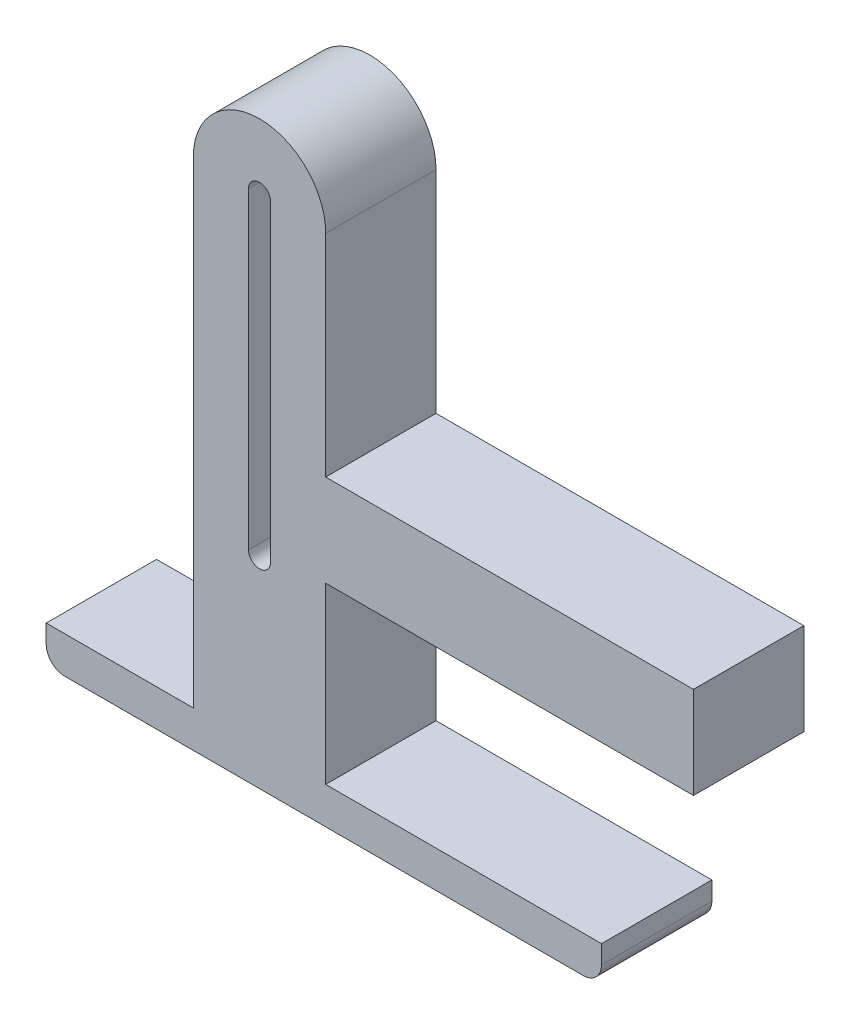
ISO-10303-21;
HEADER;
FILE_DESCRIPTION(('STEP AP214'),'2;1');
FILE_NAME('part.step','',(''),(''),'','','');
FILE_SCHEMA(('AUTOMOTIVE_DESIGN { 1 0 10303 214 1 1 1 1 }'));
ENDSEC;
DATA;
#1=APPLICATION_CONTEXT('core data for automotive mechanical design processes');
#2=APPLICATION_PROTOCOL_DEFINITION('international standard','automotive_design',2000,#1);
#3=PRODUCT_CONTEXT('',#1,'mechanical');
#4=PRODUCT('Part','Part','',(#3));
#5=PRODUCT_RELATED_PRODUCT_CATEGORY('part','',(#4));
#6=PRODUCT_DEFINITION_FORMATION('','',#4);
#7=PRODUCT_DEFINITION_CONTEXT('part definition',#1,'design');
#8=PRODUCT_DEFINITION('design','',#6,#7);
#9=PRODUCT_DEFINITION_SHAPE('','',#8);
#10=(LENGTH_UNIT() NAMED_UNIT(*) SI_UNIT(.MILLI.,.METRE.));
#11=(NAMED_UNIT(*) PLANE_ANGLE_UNIT() SI_UNIT($,.RADIAN.));
#12=(NAMED_UNIT(*) SI_UNIT($,.STERADIAN.) SOLID_ANGLE_UNIT());
#13=UNCERTAINTY_MEASURE_WITH_UNIT(LENGTH_MEASURE(1.E-05),#10,'distance_accuracy_value','');
#14=(GEOMETRIC_REPRESENTATION_CONTEXT(3) GLOBAL_UNCERTAINTY_ASSIGNED_CONTEXT((#13)) GLOBAL_UNIT_ASSIGNED_CONTEXT((#10,
#11,#12)) REPRESENTATION_CONTEXT('',''));
#15=CARTESIAN_POINT('',(0.,0.,0.));
#16=DIRECTION('',(0.,0.,1.));
#17=DIRECTION('',(1.,0.,0.));
#18=AXIS2_PLACEMENT_3D('',#15,#16,#17);
#19=CARTESIAN_POINT('',(3.6,0.,6.));
#20=DIRECTION('',(-1.,0.,0.));
#21=DIRECTION('',(0.,0.,1.));
#22=AXIS2_PLACEMENT_3D('',#19,#20,#21);
#23=PLANE('',#22);
#24=DIRECTION('',(0.,0.,1.));
#25=VECTOR('',#24,1.);
#26=CARTESIAN_POINT('',(3.6,5.522835855,6.));
#27=LINE('',#26,#25);
#28=CARTESIAN_POINT('',(3.6,5.522835855,0.));
#29=VERTEX_POINT('',#28);
#30=CARTESIAN_POINT('',(3.6,5.522835855,6.));
#31=VERTEX_POINT('',#30);
#32=EDGE_CURVE('E206',#29,#31,#27,.T.);
#33=ORIENTED_EDGE('',*,*,#32,.F.);
#34=DIRECTION('',(0.,1.,0.));
#35=VECTOR('',#34,1.);
#36=CARTESIAN_POINT('',(3.6,0.,0.));
#37=LINE('',#36,#35);
#38=CARTESIAN_POINT('',(3.6,17.,0.));
#39=VERTEX_POINT('',#38);
#40=EDGE_CURVE('E278',#29,#39,#37,.T.);
#41=ORIENTED_EDGE('',*,*,#40,.T.);
#42=DIRECTION('',(0.,0.,-1.));
#43=VECTOR('',#42,1.);
#44=CARTESIAN_POINT('',(3.6,17.,6.));
#45=LINE('',#44,#43);
#46=CARTESIAN_POINT('',(3.6,17.,6.));
#47=VERTEX_POINT('',#46);
#48=EDGE_CURVE('E286',#47,#39,#45,.T.);
#49=ORIENTED_EDGE('',*,*,#48,.F.);
#50=DIRECTION('',(0.,1.,0.));
#51=VECTOR('',#50,1.);
#52=CARTESIAN_POINT('',(3.6,0.,6.));
#53=LINE('',#52,#51);
#54=EDGE_CURVE('E270',#31,#47,#53,.T.);
#55=ORIENTED_EDGE('',*,*,#54,.F.);
#56=EDGE_LOOP('',(#33,#41,#49,#55));
#57=FACE_BOUND('',#56,.T.);
#58=ADVANCED_FACE('F37',(#57),#23,.F.);
#59=CARTESIAN_POINT('',(3.6,-8.95432829,6.));
#60=VERTEX_POINT('',#59);
#61=CARTESIAN_POINT('',(3.6,0.522835855000001,6.));
#62=VERTEX_POINT('',#61);
#63=EDGE_CURVE('E271',#60,#62,#53,.T.);
#64=ORIENTED_EDGE('',*,*,#63,.F.);
#65=DIRECTION('',(0.,0.,-1.));
#66=VECTOR('',#65,1.);
#67=CARTESIAN_POINT('',(3.6,-8.95432829,6.));
#68=LINE('',#67,#66);
#69=CARTESIAN_POINT('',(3.6,-8.95432829,0.));
#70=VERTEX_POINT('',#69);
#71=EDGE_CURVE('E202',#60,#70,#68,.T.);
#72=ORIENTED_EDGE('',*,*,#71,.T.);
#73=CARTESIAN_POINT('',(3.6,0.522835855000001,0.));
#74=VERTEX_POINT('',#73);
#75=EDGE_CURVE('E183',#70,#74,#37,.T.);
#76=ORIENTED_EDGE('',*,*,#75,.T.);
#77=DIRECTION('',(0.,0.,-1.));
#78=VECTOR('',#77,1.);
#79=CARTESIAN_POINT('',(3.6,0.522835855000002,6.));
#80=LINE('',#79,#78);
#81=EDGE_CURVE('E211',#62,#74,#80,.T.);
#82=ORIENTED_EDGE('',*,*,#81,.F.);
#83=EDGE_LOOP('',(#64,#72,#76,#82));
#84=FACE_BOUND('',#83,.T.);
#85=ADVANCED_FACE('F344',(#84),#23,.F.);
#86=CARTESIAN_POINT('',(0.,17.,6.));
#87=DIRECTION('',(0.,0.,1.));
#88=DIRECTION('',(1.,0.,0.));
#89=AXIS2_PLACEMENT_3D('',#86,#87,#88);
#90=PLANE('',#89);
#91=DIRECTION('',(1.,0.,0.));
#92=VECTOR('',#91,1.);
#93=CARTESIAN_POINT('',(3.6,-10.95432829,6.));
#94=LINE('',#93,#92);
#95=CARTESIAN_POINT('',(-10.6,-10.95432829,6.));
#96=VERTEX_POINT('',#95);
#97=CARTESIAN_POINT('',(17.6,-10.95432829,6.));
#98=VERTEX_POINT('',#97);
#99=EDGE_CURVE('E267',#96,#98,#94,.T.);
#100=ORIENTED_EDGE('',*,*,#99,.T.);
#101=CARTESIAN_POINT('',(17.6,-9.95432829,6.));
#102=DIRECTION('',(0.,0.,1.));
#103=DIRECTION('',(1.,0.,0.));
#104=AXIS2_PLACEMENT_3D('',#101,#102,#103);
#105=CIRCLE('',#104,1.);
#106=CARTESIAN_POINT('',(18.6,-9.95432829,6.));
#107=VERTEX_POINT('',#106);
#108=EDGE_CURVE('E45',#98,#107,#105,.T.);
#109=ORIENTED_EDGE('',*,*,#108,.T.);
#110=DIRECTION('',(0.,-1.,0.));
#111=VECTOR('',#110,1.);
#112=CARTESIAN_POINT('',(18.6,-8.95432829,6.));
#113=LINE('',#112,#111);
#114=CARTESIAN_POINT('',(18.6,-8.95432829,6.));
#115=VERTEX_POINT('',#114);
#116=EDGE_CURVE('E175',#115,#107,#113,.T.);
#117=ORIENTED_EDGE('',*,*,#116,.F.);
#118=DIRECTION('',(1.,0.,0.));
#119=VECTOR('',#118,1.);
#120=CARTESIAN_POINT('',(-11.6,-8.95432829,6.));
#121=LINE('',#120,#119);
#122=EDGE_CURVE('E191',#60,#115,#121,.T.);
#123=ORIENTED_EDGE('',*,*,#122,.F.);
#124=ORIENTED_EDGE('',*,*,#63,.T.);
#125=DIRECTION('',(-1.,0.,0.));
#126=VECTOR('',#125,1.);
#127=CARTESIAN_POINT('',(23.6,0.522835855000002,6.));
#128=LINE('',#127,#126);
#129=CARTESIAN_POINT('',(23.6,0.522835855000002,6.));
#130=VERTEX_POINT('',#129);
#131=EDGE_CURVE('E223',#130,#62,#128,.T.);
#132=ORIENTED_EDGE('',*,*,#131,.F.);
#133=DIRECTION('',(0.,-1.,0.));
#134=VECTOR('',#133,1.);
#135=CARTESIAN_POINT('',(23.6,0.522835855000002,6.));
#136=LINE('',#135,#134);
#137=CARTESIAN_POINT('',(23.6,5.522835855,6.));
#138=VERTEX_POINT('',#137);
#139=EDGE_CURVE('E213',#138,#130,#136,.T.);
#140=ORIENTED_EDGE('',*,*,#139,.F.);
#141=DIRECTION('',(-1.,0.,0.));
#142=VECTOR('',#141,1.);
#143=CARTESIAN_POINT('',(23.6,5.522835855,6.));
#144=LINE('',#143,#142);
#145=EDGE_CURVE('E226',#138,#31,#144,.T.);
#146=ORIENTED_EDGE('',*,*,#145,.T.);
#147=ORIENTED_EDGE('',*,*,#54,.T.);
#148=CARTESIAN_POINT('',(0.,17.,6.));
#149=DIRECTION('',(0.,0.,1.));
#150=DIRECTION('',(1.,0.,0.));
#151=AXIS2_PLACEMENT_3D('',#148,#149,#150);
#152=CIRCLE('',#151,3.6);
#153=CARTESIAN_POINT('',(-3.6,17.,6.));
#154=VERTEX_POINT('',#153);
#155=EDGE_CURVE('E273',#47,#154,#152,.T.);
#156=ORIENTED_EDGE('',*,*,#155,.T.);
#157=DIRECTION('',(0.,-1.,0.));
#158=VECTOR('',#157,1.);
#159=CARTESIAN_POINT('',(-3.6,-10.95432829,6.));
#160=LINE('',#159,#158);
#161=CARTESIAN_POINT('',(-3.6,-8.95432829,6.));
#162=VERTEX_POINT('',#161);
#163=EDGE_CURVE('E264',#154,#162,#160,.T.);
#164=ORIENTED_EDGE('',*,*,#163,.T.);
#165=CARTESIAN_POINT('',(-11.6,-8.95432829,6.));
#166=VERTEX_POINT('',#165);
#167=EDGE_CURVE('E201',#166,#162,#121,.T.);
#168=ORIENTED_EDGE('',*,*,#167,.F.);
#169=DIRECTION('',(0.,-1.,0.));
#170=VECTOR('',#169,1.);
#171=CARTESIAN_POINT('',(-11.6,-8.95432829,6.));
#172=LINE('',#171,#170);
#173=CARTESIAN_POINT('',(-11.6,-9.95432829,6.));
#174=VERTEX_POINT('',#173);
#175=EDGE_CURVE('E192',#166,#174,#172,.T.);
#176=ORIENTED_EDGE('',*,*,#175,.T.);
#177=CARTESIAN_POINT('',(-10.6,-9.95432829,6.));
#178=DIRECTION('',(0.,0.,1.));
#179=DIRECTION('',(1.,0.,0.));
#180=AXIS2_PLACEMENT_3D('',#177,#178,#179);
#181=CIRCLE('',#180,1.);
#182=EDGE_CURVE('E301',#174,#96,#181,.T.);
#183=ORIENTED_EDGE('',*,*,#182,.T.);
#184=EDGE_LOOP('',(#100,#109,#117,#123,#124,#132,#140,#146,#147,#156,#164,#168,#176,#183));
#185=FACE_BOUND('',#184,.T.);
#186=DIRECTION('',(0.,1.,0.));
#187=VECTOR('',#186,1.);
#188=CARTESIAN_POINT('',(0.600000000000001,0.,6.));
#189=LINE('',#188,#187);
#190=CARTESIAN_POINT('',(0.600000000000001,0.,6.));
#191=VERTEX_POINT('',#190);
#192=CARTESIAN_POINT('',(0.600000000000001,17.,6.));
#193=VERTEX_POINT('',#192);
#194=EDGE_CURVE('E235',#191,#193,#189,.T.);
#195=ORIENTED_EDGE('',*,*,#194,.F.);
#196=CARTESIAN_POINT('',(0.,0.,6.));
#197=DIRECTION('',(0.,0.,1.));
#198=DIRECTION('',(1.,0.,0.));
#199=AXIS2_PLACEMENT_3D('',#196,#197,#198);
#200=CIRCLE('',#199,0.600000000000001);
#201=CARTESIAN_POINT('',(-0.600000000000001,0.,6.));
#202=VERTEX_POINT('',#201);
#203=EDGE_CURVE('E233',#202,#191,#200,.T.);
#204=ORIENTED_EDGE('',*,*,#203,.F.);
#205=DIRECTION('',(0.,-1.,0.));
#206=VECTOR('',#205,1.);
#207=CARTESIAN_POINT('',(-0.600000000000001,0.,6.));
#208=LINE('',#207,#206);
#209=CARTESIAN_POINT('',(-0.600000000000001,17.,6.));
#210=VERTEX_POINT('',#209);
#211=EDGE_CURVE('E241',#210,#202,#208,.T.);
#212=ORIENTED_EDGE('',*,*,#211,.F.);
#213=CARTESIAN_POINT('',(0.,17.,6.));
#214=DIRECTION('',(0.,0.,1.));
#215=DIRECTION('',(1.,0.,0.));
#216=AXIS2_PLACEMENT_3D('',#213,#214,#215);
#217=CIRCLE('',#216,0.600000000000001);
#218=EDGE_CURVE('E238',#193,#210,#217,.T.);
#219=ORIENTED_EDGE('',*,*,#218,.F.);
#220=EDGE_LOOP('',(#195,#204,#212,#219));
#221=FACE_BOUND('',#220,.T.);
#222=ADVANCED_FACE('F304',(#185,#221),#90,.T.);
#223=CARTESIAN_POINT('',(0.,17.,0.));
#224=DIRECTION('',(0.,0.,1.));
#225=DIRECTION('',(1.,0.,0.));
#226=AXIS2_PLACEMENT_3D('',#223,#224,#225);
#227=PLANE('',#226);
#228=DIRECTION('',(0.,1.,0.));
#229=VECTOR('',#228,1.);
#230=CARTESIAN_POINT('',(18.6,-8.95432829,0.));
#231=LINE('',#230,#229);
#232=CARTESIAN_POINT('',(18.6,-9.95432829,0.));
#233=VERTEX_POINT('',#232);
#234=CARTESIAN_POINT('',(18.6,-8.95432829,0.));
#235=VERTEX_POINT('',#234);
#236=EDGE_CURVE('E165',#233,#235,#231,.T.);
#237=ORIENTED_EDGE('',*,*,#236,.F.);
#238=CARTESIAN_POINT('',(17.6,-9.95432829,0.));
#239=DIRECTION('',(0.,0.,1.));
#240=DIRECTION('',(1.,0.,0.));
#241=AXIS2_PLACEMENT_3D('',#238,#239,#240);
#242=CIRCLE('',#241,1.);
#243=CARTESIAN_POINT('',(17.6,-10.95432829,0.));
#244=VERTEX_POINT('',#243);
#245=EDGE_CURVE('E295',#233,#244,#242,.F.);
#246=ORIENTED_EDGE('',*,*,#245,.T.);
#247=DIRECTION('',(1.,0.,0.));
#248=VECTOR('',#247,1.);
#249=CARTESIAN_POINT('',(3.6,-10.95432829,0.));
#250=LINE('',#249,#248);
#251=CARTESIAN_POINT('',(-10.6,-10.95432829,0.));
#252=VERTEX_POINT('',#251);
#253=EDGE_CURVE('E263',#252,#244,#250,.T.);
#254=ORIENTED_EDGE('',*,*,#253,.F.);
#255=CARTESIAN_POINT('',(-10.6,-9.95432829,0.));
#256=DIRECTION('',(0.,0.,1.));
#257=DIRECTION('',(1.,0.,0.));
#258=AXIS2_PLACEMENT_3D('',#255,#256,#257);
#259=CIRCLE('',#258,1.);
#260=CARTESIAN_POINT('',(-11.6,-9.95432829,0.));
#261=VERTEX_POINT('',#260);
#262=EDGE_CURVE('E293',#252,#261,#259,.F.);
#263=ORIENTED_EDGE('',*,*,#262,.T.);
#264=DIRECTION('',(0.,1.,0.));
#265=VECTOR('',#264,1.);
#266=CARTESIAN_POINT('',(-11.6,-8.95432829,0.));
#267=LINE('',#266,#265);
#268=CARTESIAN_POINT('',(-11.6,-8.95432829,0.));
#269=VERTEX_POINT('',#268);
#270=EDGE_CURVE('E194',#261,#269,#267,.T.);
#271=ORIENTED_EDGE('',*,*,#270,.T.);
#272=DIRECTION('',(1.,0.,0.));
#273=VECTOR('',#272,1.);
#274=CARTESIAN_POINT('',(-11.6,-8.95432829,0.));
#275=LINE('',#274,#273);
#276=CARTESIAN_POINT('',(-3.6,-8.95432829,0.));
#277=VERTEX_POINT('',#276);
#278=EDGE_CURVE('E186',#269,#277,#275,.T.);
#279=ORIENTED_EDGE('',*,*,#278,.T.);
#280=DIRECTION('',(0.,-1.,0.));
#281=VECTOR('',#280,1.);
#282=CARTESIAN_POINT('',(-3.6,0.,0.));
#283=LINE('',#282,#281);
#284=CARTESIAN_POINT('',(-3.6,17.,0.));
#285=VERTEX_POINT('',#284);
#286=EDGE_CURVE('E268',#285,#277,#283,.T.);
#287=ORIENTED_EDGE('',*,*,#286,.F.);
#288=CARTESIAN_POINT('',(0.,17.,0.));
#289=DIRECTION('',(0.,0.,1.));
#290=DIRECTION('',(1.,0.,0.));
#291=AXIS2_PLACEMENT_3D('',#288,#289,#290);
#292=CIRCLE('',#291,3.6);
#293=EDGE_CURVE('E280',#39,#285,#292,.T.);
#294=ORIENTED_EDGE('',*,*,#293,.F.);
#295=ORIENTED_EDGE('',*,*,#40,.F.);
#296=DIRECTION('',(-1.,0.,0.));
#297=VECTOR('',#296,1.);
#298=CARTESIAN_POINT('',(23.6,5.522835855,0.));
#299=LINE('',#298,#297);
#300=CARTESIAN_POINT('',(23.6,5.522835855,0.));
#301=VERTEX_POINT('',#300);
#302=EDGE_CURVE('E229',#301,#29,#299,.T.);
#303=ORIENTED_EDGE('',*,*,#302,.F.);
#304=DIRECTION('',(0.,1.,0.));
#305=VECTOR('',#304,1.);
#306=CARTESIAN_POINT('',(23.6,0.522835855000001,0.));
#307=LINE('',#306,#305);
#308=CARTESIAN_POINT('',(23.6,0.522835855000001,0.));
#309=VERTEX_POINT('',#308);
#310=EDGE_CURVE('E207',#309,#301,#307,.T.);
#311=ORIENTED_EDGE('',*,*,#310,.F.);
#312=DIRECTION('',(-1.,0.,0.));
#313=VECTOR('',#312,1.);
#314=CARTESIAN_POINT('',(23.6,0.522835855000001,0.));
#315=LINE('',#314,#313);
#316=EDGE_CURVE('E217',#309,#74,#315,.T.);
#317=ORIENTED_EDGE('',*,*,#316,.T.);
#318=ORIENTED_EDGE('',*,*,#75,.F.);
#319=EDGE_CURVE('E179',#70,#235,#275,.T.);
#320=ORIENTED_EDGE('',*,*,#319,.T.);
#321=EDGE_LOOP('',(#237,#246,#254,#263,#271,#279,#287,#294,#295,#303,#311,#317,#318,#320));
#322=FACE_BOUND('',#321,.T.);
#323=CARTESIAN_POINT('',(0.,0.,0.));
#324=DIRECTION('',(0.,0.,1.));
#325=DIRECTION('',(1.,0.,0.));
#326=AXIS2_PLACEMENT_3D('',#323,#324,#325);
#327=CIRCLE('',#326,0.600000000000001);
#328=CARTESIAN_POINT('',(-0.600000000000001,0.,0.));
#329=VERTEX_POINT('',#328);
#330=CARTESIAN_POINT('',(0.600000000000001,0.,0.));
#331=VERTEX_POINT('',#330);
#332=EDGE_CURVE('E232',#329,#331,#327,.T.);
#333=ORIENTED_EDGE('',*,*,#332,.T.);
#334=DIRECTION('',(0.,1.,0.));
#335=VECTOR('',#334,1.);
#336=CARTESIAN_POINT('',(0.600000000000001,0.,0.));
#337=LINE('',#336,#335);
#338=CARTESIAN_POINT('',(0.600000000000001,17.,0.));
#339=VERTEX_POINT('',#338);
#340=EDGE_CURVE('E246',#331,#339,#337,.T.);
#341=ORIENTED_EDGE('',*,*,#340,.T.);
#342=CARTESIAN_POINT('',(0.,17.,0.));
#343=DIRECTION('',(0.,0.,1.));
#344=DIRECTION('',(1.,0.,0.));
#345=AXIS2_PLACEMENT_3D('',#342,#343,#344);
#346=CIRCLE('',#345,0.600000000000001);
#347=CARTESIAN_POINT('',(-0.600000000000001,17.,0.));
#348=VERTEX_POINT('',#347);
#349=EDGE_CURVE('E249',#339,#348,#346,.T.);
#350=ORIENTED_EDGE('',*,*,#349,.T.);
#351=DIRECTION('',(0.,-1.,0.));
#352=VECTOR('',#351,1.);
#353=CARTESIAN_POINT('',(-0.600000000000001,0.,0.));
#354=LINE('',#353,#352);
#355=EDGE_CURVE('E236',#348,#329,#354,.T.);
#356=ORIENTED_EDGE('',*,*,#355,.T.);
#357=EDGE_LOOP('',(#333,#341,#350,#356));
#358=FACE_BOUND('',#357,.T.);
#359=ADVANCED_FACE('F180',(#322,#358),#227,.F.);
#360=CARTESIAN_POINT('',(3.6,-10.95432829,6.));
#361=DIRECTION('',(0.,1.,0.));
#362=DIRECTION('',(0.,0.,1.));
#363=AXIS2_PLACEMENT_3D('',#360,#361,#362);
#364=PLANE('',#363);
#365=ORIENTED_EDGE('',*,*,#253,.T.);
#366=DIRECTION('',(0.,0.,-1.));
#367=VECTOR('',#366,1.);
#368=CARTESIAN_POINT('',(17.6,-10.95432829,6.));
#369=LINE('',#368,#367);
#370=EDGE_CURVE('E58',#244,#98,#369,.F.);
#371=ORIENTED_EDGE('',*,*,#370,.T.);
#372=ORIENTED_EDGE('',*,*,#99,.F.);
#373=DIRECTION('',(0.,0.,-1.));
#374=VECTOR('',#373,1.);
#375=CARTESIAN_POINT('',(-10.6,-10.95432829,6.));
#376=LINE('',#375,#374);
#377=EDGE_CURVE('E297',#96,#252,#376,.T.);
#378=ORIENTED_EDGE('',*,*,#377,.T.);
#379=EDGE_LOOP('',(#365,#371,#372,#378));
#380=FACE_BOUND('',#379,.T.);
#381=ADVANCED_FACE('F309',(#380),#364,.F.);
#382=CARTESIAN_POINT('',(0.,17.,6.));
#383=DIRECTION('',(0.,0.,-1.));
#384=DIRECTION('',(-1.,0.,0.));
#385=AXIS2_PLACEMENT_3D('',#382,#383,#384);
#386=CYLINDRICAL_SURFACE('',#385,3.6);
#387=ORIENTED_EDGE('',*,*,#293,.T.);
#388=DIRECTION('',(0.,0.,-1.));
#389=VECTOR('',#388,1.);
#390=CARTESIAN_POINT('',(-3.6,17.,6.));
#391=LINE('',#390,#389);
#392=EDGE_CURVE('E276',#154,#285,#391,.T.);
#393=ORIENTED_EDGE('',*,*,#392,.F.);
#394=ORIENTED_EDGE('',*,*,#155,.F.);
#395=ORIENTED_EDGE('',*,*,#48,.T.);
#396=EDGE_LOOP('',(#387,#393,#394,#395));
#397=FACE_BOUND('',#396,.T.);
#398=ADVANCED_FACE('F325',(#397),#386,.T.);
#399=CARTESIAN_POINT('',(-3.6,0.,6.));
#400=DIRECTION('',(1.,0.,0.));
#401=DIRECTION('',(0.,0.,-1.));
#402=AXIS2_PLACEMENT_3D('',#399,#400,#401);
#403=PLANE('',#402);
#404=ORIENTED_EDGE('',*,*,#286,.T.);
#405=DIRECTION('',(0.,0.,1.));
#406=VECTOR('',#405,1.);
#407=CARTESIAN_POINT('',(-3.6,-8.95432829,6.));
#408=LINE('',#407,#406);
#409=EDGE_CURVE('E289',#277,#162,#408,.T.);
#410=ORIENTED_EDGE('',*,*,#409,.T.);
#411=ORIENTED_EDGE('',*,*,#163,.F.);
#412=ORIENTED_EDGE('',*,*,#392,.T.);
#413=EDGE_LOOP('',(#404,#410,#411,#412));
#414=FACE_BOUND('',#413,.T.);
#415=ADVANCED_FACE('F321',(#414),#403,.F.);
#416=CARTESIAN_POINT('',(0.,0.,6.));
#417=DIRECTION('',(0.,0.,-1.));
#418=DIRECTION('',(-1.,0.,0.));
#419=AXIS2_PLACEMENT_3D('',#416,#417,#418);
#420=CYLINDRICAL_SURFACE('',#419,0.600000000000001);
#421=ORIENTED_EDGE('',*,*,#332,.F.);
#422=DIRECTION('',(0.,0.,-1.));
#423=VECTOR('',#422,1.);
#424=CARTESIAN_POINT('',(-0.600000000000001,0.,6.));
#425=LINE('',#424,#423);
#426=EDGE_CURVE('E243',#202,#329,#425,.T.);
#427=ORIENTED_EDGE('',*,*,#426,.F.);
#428=ORIENTED_EDGE('',*,*,#203,.T.);
#429=DIRECTION('',(0.,0.,-1.));
#430=VECTOR('',#429,1.);
#431=CARTESIAN_POINT('',(0.600000000000001,0.,6.));
#432=LINE('',#431,#430);
#433=EDGE_CURVE('E260',#191,#331,#432,.T.);
#434=ORIENTED_EDGE('',*,*,#433,.T.);
#435=EDGE_LOOP('',(#421,#427,#428,#434));
#436=FACE_BOUND('',#435,.T.);
#437=ADVANCED_FACE('F384',(#436),#420,.F.);
#438=CARTESIAN_POINT('',(0.600000000000001,0.,6.));
#439=DIRECTION('',(-1.,0.,0.));
#440=DIRECTION('',(0.,0.,1.));
#441=AXIS2_PLACEMENT_3D('',#438,#439,#440);
#442=PLANE('',#441);
#443=ORIENTED_EDGE('',*,*,#340,.F.);
#444=ORIENTED_EDGE('',*,*,#433,.F.);
#445=ORIENTED_EDGE('',*,*,#194,.T.);
#446=DIRECTION('',(0.,0.,-1.));
#447=VECTOR('',#446,1.);
#448=CARTESIAN_POINT('',(0.600000000000001,17.,6.));
#449=LINE('',#448,#447);
#450=EDGE_CURVE('E258',#193,#339,#449,.T.);
#451=ORIENTED_EDGE('',*,*,#450,.T.);
#452=EDGE_LOOP('',(#443,#444,#445,#451));
#453=FACE_BOUND('',#452,.T.);
#454=ADVANCED_FACE('F380',(#453),#442,.T.);
#455=CARTESIAN_POINT('',(0.,17.,6.));
#456=DIRECTION('',(0.,0.,-1.));
#457=DIRECTION('',(-1.,0.,0.));
#458=AXIS2_PLACEMENT_3D('',#455,#456,#457);
#459=CYLINDRICAL_SURFACE('',#458,0.600000000000001);
#460=ORIENTED_EDGE('',*,*,#349,.F.);
#461=ORIENTED_EDGE('',*,*,#450,.F.);
#462=ORIENTED_EDGE('',*,*,#218,.T.);
#463=DIRECTION('',(0.,0.,-1.));
#464=VECTOR('',#463,1.);
#465=CARTESIAN_POINT('',(-0.600000000000001,17.,6.));
#466=LINE('',#465,#464);
#467=EDGE_CURVE('E256',#210,#348,#466,.T.);
#468=ORIENTED_EDGE('',*,*,#467,.T.);
#469=EDGE_LOOP('',(#460,#461,#462,#468));
#470=FACE_BOUND('',#469,.T.);
#471=ADVANCED_FACE('F376',(#470),#459,.F.);
#472=CARTESIAN_POINT('',(-0.600000000000001,0.,6.));
#473=DIRECTION('',(1.,0.,0.));
#474=DIRECTION('',(0.,0.,-1.));
#475=AXIS2_PLACEMENT_3D('',#472,#473,#474);
#476=PLANE('',#475);
#477=ORIENTED_EDGE('',*,*,#355,.F.);
#478=ORIENTED_EDGE('',*,*,#467,.F.);
#479=ORIENTED_EDGE('',*,*,#211,.T.);
#480=ORIENTED_EDGE('',*,*,#426,.T.);
#481=EDGE_LOOP('',(#477,#478,#479,#480));
#482=FACE_BOUND('',#481,.T.);
#483=ADVANCED_FACE('F373',(#482),#476,.T.);
#484=CARTESIAN_POINT('',(23.6,5.522835855,6.));
#485=DIRECTION('',(0.,-1.,0.));
#486=DIRECTION('',(0.,0.,-1.));
#487=AXIS2_PLACEMENT_3D('',#484,#485,#486);
#488=PLANE('',#487);
#489=ORIENTED_EDGE('',*,*,#32,.T.);
#490=ORIENTED_EDGE('',*,*,#145,.F.);
#491=DIRECTION('',(0.,0.,1.));
#492=VECTOR('',#491,1.);
#493=CARTESIAN_POINT('',(23.6,5.522835855,6.));
#494=LINE('',#493,#492);
#495=EDGE_CURVE('E210',#301,#138,#494,.T.);
#496=ORIENTED_EDGE('',*,*,#495,.F.);
#497=ORIENTED_EDGE('',*,*,#302,.T.);
#498=EDGE_LOOP('',(#489,#490,#496,#497));
#499=FACE_BOUND('',#498,.T.);
#500=ADVANCED_FACE('F332',(#499),#488,.F.);
#501=CARTESIAN_POINT('',(23.6,0.522835855000002,6.));
#502=DIRECTION('',(0.,1.,0.));
#503=DIRECTION('',(0.,0.,1.));
#504=AXIS2_PLACEMENT_3D('',#501,#502,#503);
#505=PLANE('',#504);
#506=ORIENTED_EDGE('',*,*,#81,.T.);
#507=ORIENTED_EDGE('',*,*,#316,.F.);
#508=DIRECTION('',(0.,0.,-1.));
#509=VECTOR('',#508,1.);
#510=CARTESIAN_POINT('',(23.6,0.522835855000002,6.));
#511=LINE('',#510,#509);
#512=EDGE_CURVE('E215',#130,#309,#511,.T.);
#513=ORIENTED_EDGE('',*,*,#512,.F.);
#514=ORIENTED_EDGE('',*,*,#131,.T.);
#515=EDGE_LOOP('',(#506,#507,#513,#514));
#516=FACE_BOUND('',#515,.T.);
#517=ADVANCED_FACE('F340',(#516),#505,.F.);
#518=CARTESIAN_POINT('',(23.6,0.,0.));
#519=DIRECTION('',(-1.,0.,0.));
#520=DIRECTION('',(0.,0.,1.));
#521=AXIS2_PLACEMENT_3D('',#518,#519,#520);
#522=PLANE('',#521);
#523=ORIENTED_EDGE('',*,*,#310,.T.);
#524=ORIENTED_EDGE('',*,*,#495,.T.);
#525=ORIENTED_EDGE('',*,*,#139,.T.);
#526=ORIENTED_EDGE('',*,*,#512,.T.);
#527=EDGE_LOOP('',(#523,#524,#525,#526));
#528=FACE_BOUND('',#527,.T.);
#529=ADVANCED_FACE('F336',(#528),#522,.F.);
#530=CARTESIAN_POINT('',(-11.6,0.,0.));
#531=DIRECTION('',(1.,0.,0.));
#532=DIRECTION('',(0.,0.,-1.));
#533=AXIS2_PLACEMENT_3D('',#530,#531,#532);
#534=PLANE('',#533);
#535=ORIENTED_EDGE('',*,*,#270,.F.);
#536=DIRECTION('',(0.,0.,-1.));
#537=VECTOR('',#536,1.);
#538=CARTESIAN_POINT('',(-11.6,-9.95432829,0.));
#539=LINE('',#538,#537);
#540=EDGE_CURVE('E11',#261,#174,#539,.F.);
#541=ORIENTED_EDGE('',*,*,#540,.T.);
#542=ORIENTED_EDGE('',*,*,#175,.F.);
#543=DIRECTION('',(0.,0.,1.));
#544=VECTOR('',#543,1.);
#545=CARTESIAN_POINT('',(-11.6,-8.95432829,6.));
#546=LINE('',#545,#544);
#547=EDGE_CURVE('E187',#269,#166,#546,.T.);
#548=ORIENTED_EDGE('',*,*,#547,.F.);
#549=EDGE_LOOP('',(#535,#541,#542,#548));
#550=FACE_BOUND('',#549,.T.);
#551=ADVANCED_FACE('F315',(#550),#534,.F.);
#552=CARTESIAN_POINT('',(-11.6,-8.95432829,6.));
#553=DIRECTION('',(0.,1.,0.));
#554=DIRECTION('',(0.,0.,1.));
#555=AXIS2_PLACEMENT_3D('',#552,#553,#554);
#556=PLANE('',#555);
#557=ORIENTED_EDGE('',*,*,#409,.F.);
#558=ORIENTED_EDGE('',*,*,#278,.F.);
#559=ORIENTED_EDGE('',*,*,#547,.T.);
#560=ORIENTED_EDGE('',*,*,#167,.T.);
#561=EDGE_LOOP('',(#557,#558,#559,#560));
#562=FACE_BOUND('',#561,.T.);
#563=ADVANCED_FACE('F317',(#562),#556,.T.);
#564=ORIENTED_EDGE('',*,*,#71,.F.);
#565=ORIENTED_EDGE('',*,*,#122,.T.);
#566=DIRECTION('',(0.,0.,1.));
#567=VECTOR('',#566,1.);
#568=CARTESIAN_POINT('',(18.6,-8.95432829,6.));
#569=LINE('',#568,#567);
#570=EDGE_CURVE('E170',#235,#115,#569,.T.);
#571=ORIENTED_EDGE('',*,*,#570,.F.);
#572=ORIENTED_EDGE('',*,*,#319,.F.);
#573=EDGE_LOOP('',(#564,#565,#571,#572));
#574=FACE_BOUND('',#573,.T.);
#575=ADVANCED_FACE('F189',(#574),#556,.T.);
#576=CARTESIAN_POINT('',(18.6,0.,0.));
#577=DIRECTION('',(1.,0.,0.));
#578=DIRECTION('',(0.,0.,-1.));
#579=AXIS2_PLACEMENT_3D('',#576,#577,#578);
#580=PLANE('',#579);
#581=ORIENTED_EDGE('',*,*,#116,.T.);
#582=DIRECTION('',(0.,0.,-1.));
#583=VECTOR('',#582,1.);
#584=CARTESIAN_POINT('',(18.6,-9.95432829,0.));
#585=LINE('',#584,#583);
#586=EDGE_CURVE('E173',#107,#233,#585,.T.);
#587=ORIENTED_EDGE('',*,*,#586,.T.);
#588=ORIENTED_EDGE('',*,*,#236,.T.);
#589=ORIENTED_EDGE('',*,*,#570,.T.);
#590=EDGE_LOOP('',(#581,#587,#588,#589));
#591=FACE_BOUND('',#590,.T.);
#592=ADVANCED_FACE('F168',(#591),#580,.T.);
#593=CARTESIAN_POINT('',(17.6,-9.95432829,0.));
#594=DIRECTION('',(0.,0.,1.));
#595=DIRECTION('',(1.,0.,0.));
#596=AXIS2_PLACEMENT_3D('',#593,#594,#595);
#597=CYLINDRICAL_SURFACE('',#596,1.);
#598=ORIENTED_EDGE('',*,*,#108,.F.);
#599=ORIENTED_EDGE('',*,*,#370,.F.);
#600=ORIENTED_EDGE('',*,*,#245,.F.);
#601=ORIENTED_EDGE('',*,*,#586,.F.);
#602=EDGE_LOOP('',(#598,#599,#600,#601));
#603=FACE_BOUND('',#602,.T.);
#604=ADVANCED_FACE('F307',(#603),#597,.T.);
#605=CARTESIAN_POINT('',(-10.6,-9.95432829,6.));
#606=DIRECTION('',(0.,0.,-1.));
#607=DIRECTION('',(-1.,0.,0.));
#608=AXIS2_PLACEMENT_3D('',#605,#606,#607);
#609=CYLINDRICAL_SURFACE('',#608,1.);
#610=ORIENTED_EDGE('',*,*,#182,.F.);
#611=ORIENTED_EDGE('',*,*,#540,.F.);
#612=ORIENTED_EDGE('',*,*,#262,.F.);
#613=ORIENTED_EDGE('',*,*,#377,.F.);
#614=EDGE_LOOP('',(#610,#611,#612,#613));
#615=FACE_BOUND('',#614,.T.);
#616=ADVANCED_FACE('F39',(#615),#609,.T.);
#617=CLOSED_SHELL('',(#58,#85,#222,#359,#381,#398,#415,#437,#454,#471,#483,#500,#517,#529,#551,
#563,#575,#592,#604,#616));
#618=MANIFOLD_SOLID_BREP('B2',#617);
#619=ADVANCED_BREP_SHAPE_REPRESENTATION('',(#18,#618),#14);
#620=SHAPE_DEFINITION_REPRESENTATION(#9,#619);
ENDSEC;
END-ISO-10303-21;
